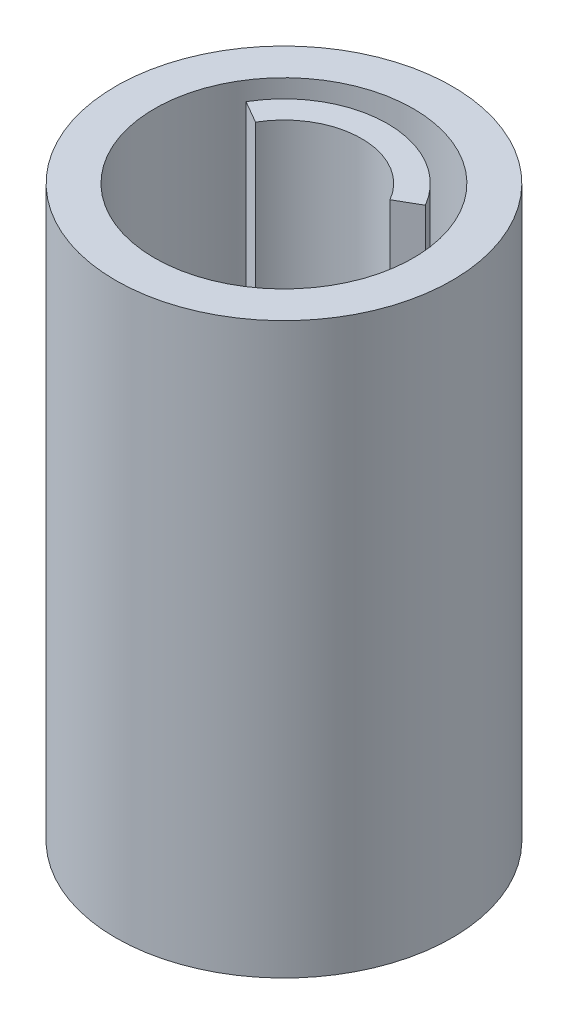
ISO-10303-21;
HEADER;
FILE_DESCRIPTION(('STEP AP214'),'2;1');
FILE_NAME('part.step','',(''),(''),'','','');
FILE_SCHEMA(('AUTOMOTIVE_DESIGN { 1 0 10303 214 1 1 1 1 }'));
ENDSEC;
DATA;
#1=APPLICATION_CONTEXT('core data for automotive mechanical design processes');
#2=APPLICATION_PROTOCOL_DEFINITION('international standard','automotive_design',2000,#1);
#3=PRODUCT_CONTEXT('',#1,'mechanical');
#4=PRODUCT('Part','Part','',(#3));
#5=PRODUCT_RELATED_PRODUCT_CATEGORY('part','',(#4));
#6=PRODUCT_DEFINITION_FORMATION('','',#4);
#7=PRODUCT_DEFINITION_CONTEXT('part definition',#1,'design');
#8=PRODUCT_DEFINITION('design','',#6,#7);
#9=PRODUCT_DEFINITION_SHAPE('','',#8);
#10=(LENGTH_UNIT() NAMED_UNIT(*) SI_UNIT(.MILLI.,.METRE.));
#11=(NAMED_UNIT(*) PLANE_ANGLE_UNIT() SI_UNIT($,.RADIAN.));
#12=(NAMED_UNIT(*) SI_UNIT($,.STERADIAN.) SOLID_ANGLE_UNIT());
#13=UNCERTAINTY_MEASURE_WITH_UNIT(LENGTH_MEASURE(1.E-05),#10,'distance_accuracy_value','');
#14=(GEOMETRIC_REPRESENTATION_CONTEXT(3) GLOBAL_UNCERTAINTY_ASSIGNED_CONTEXT((#13)) GLOBAL_UNIT_ASSIGNED_CONTEXT((#10,
#11,#12)) REPRESENTATION_CONTEXT('',''));
#15=CARTESIAN_POINT('',(0.,0.,0.));
#16=DIRECTION('',(0.,0.,1.));
#17=DIRECTION('',(1.,0.,0.));
#18=AXIS2_PLACEMENT_3D('',#15,#16,#17);
#19=CARTESIAN_POINT('',(0.,22.,0.));
#20=DIRECTION('',(0.,1.,0.));
#21=DIRECTION('',(0.,0.,1.));
#22=AXIS2_PLACEMENT_3D('',#19,#20,#21);
#23=PLANE('',#22);
#24=CARTESIAN_POINT('',(0.,22.,0.));
#25=DIRECTION('',(0.,1.,0.));
#26=DIRECTION('',(0.,0.,1.));
#27=AXIS2_PLACEMENT_3D('',#24,#25,#26);
#28=CIRCLE('',#27,6.5);
#29=CARTESIAN_POINT('',(0.,22.,6.5));
#30=VERTEX_POINT('',#29);
#31=EDGE_CURVE('E11',#30,#30,#28,.T.);
#32=ORIENTED_EDGE('',*,*,#31,.T.);
#33=EDGE_LOOP('',(#32));
#34=FACE_BOUND('',#33,.T.);
#35=CARTESIAN_POINT('',(0.,22.,0.));
#36=DIRECTION('',(0.,1.,0.));
#37=DIRECTION('',(0.,0.,1.));
#38=AXIS2_PLACEMENT_3D('',#35,#36,#37);
#39=CIRCLE('',#38,5.);
#40=CARTESIAN_POINT('',(0.,22.,5.));
#41=VERTEX_POINT('',#40);
#42=EDGE_CURVE('E138',#41,#41,#39,.T.);
#43=ORIENTED_EDGE('',*,*,#42,.F.);
#44=EDGE_LOOP('',(#43));
#45=FACE_BOUND('',#44,.T.);
#46=ADVANCED_FACE('F44',(#34,#45),#23,.T.);
#47=CARTESIAN_POINT('',(0.,22.,0.));
#48=DIRECTION('',(0.,-1.,0.));
#49=DIRECTION('',(0.,0.,-1.));
#50=AXIS2_PLACEMENT_3D('',#47,#48,#49);
#51=CYLINDRICAL_SURFACE('',#50,6.5);
#52=ORIENTED_EDGE('',*,*,#31,.F.);
#53=EDGE_LOOP('',(#52));
#54=FACE_BOUND('',#53,.T.);
#55=CARTESIAN_POINT('',(0.,0.,0.));
#56=DIRECTION('',(0.,1.,0.));
#57=DIRECTION('',(0.,0.,1.));
#58=AXIS2_PLACEMENT_3D('',#55,#56,#57);
#59=CIRCLE('',#58,6.5);
#60=CARTESIAN_POINT('',(0.,0.,6.5));
#61=VERTEX_POINT('',#60);
#62=EDGE_CURVE('E48',#61,#61,#59,.T.);
#63=ORIENTED_EDGE('',*,*,#62,.T.);
#64=EDGE_LOOP('',(#63));
#65=FACE_BOUND('',#64,.T.);
#66=ADVANCED_FACE('F46',(#54,#65),#51,.T.);
#67=CARTESIAN_POINT('',(0.,0.,0.));
#68=DIRECTION('',(0.,1.,0.));
#69=DIRECTION('',(0.,0.,1.));
#70=AXIS2_PLACEMENT_3D('',#67,#68,#69);
#71=PLANE('',#70);
#72=CARTESIAN_POINT('',(0.,0.,-4.5));
#73=DIRECTION('',(0.,1.,0.));
#74=DIRECTION('',(0.,0.,1.));
#75=AXIS2_PLACEMENT_3D('',#72,#73,#74);
#76=CIRCLE('',#75,0.3);
#77=CARTESIAN_POINT('',(0.,0.,-4.2));
#78=VERTEX_POINT('',#77);
#79=EDGE_CURVE('E283',#78,#78,#76,.T.);
#80=ORIENTED_EDGE('',*,*,#79,.T.);
#81=EDGE_LOOP('',(#80));
#82=FACE_BOUND('',#81,.T.);
#83=CARTESIAN_POINT('',(-3.18198051533947,0.,-3.18198051533946));
#84=DIRECTION('',(0.,1.,0.));
#85=DIRECTION('',(0.,0.,-1.));
#86=AXIS2_PLACEMENT_3D('',#83,#84,#85);
#87=CIRCLE('',#86,0.3);
#88=CARTESIAN_POINT('',(-3.18198051533947,0.,-3.48198051533946));
#89=VERTEX_POINT('',#88);
#90=EDGE_CURVE('E295',#89,#89,#87,.T.);
#91=ORIENTED_EDGE('',*,*,#90,.T.);
#92=EDGE_LOOP('',(#91));
#93=FACE_BOUND('',#92,.T.);
#94=CARTESIAN_POINT('',(3.18198051533947,0.,-3.18198051533946));
#95=DIRECTION('',(0.,1.,0.));
#96=DIRECTION('',(0.,0.,1.));
#97=AXIS2_PLACEMENT_3D('',#94,#95,#96);
#98=CIRCLE('',#97,0.3);
#99=CARTESIAN_POINT('',(3.18198051533947,0.,-2.88198051533946));
#100=VERTEX_POINT('',#99);
#101=EDGE_CURVE('E305',#100,#100,#98,.T.);
#102=ORIENTED_EDGE('',*,*,#101,.T.);
#103=EDGE_LOOP('',(#102));
#104=FACE_BOUND('',#103,.T.);
#105=CARTESIAN_POINT('',(0.,0.,3.));
#106=DIRECTION('',(0.,1.,0.));
#107=DIRECTION('',(0.,0.,1.));
#108=AXIS2_PLACEMENT_3D('',#105,#106,#107);
#109=CIRCLE('',#108,0.5);
#110=CARTESIAN_POINT('',(0.,0.,3.5));
#111=VERTEX_POINT('',#110);
#112=EDGE_CURVE('E309',#111,#111,#109,.T.);
#113=ORIENTED_EDGE('',*,*,#112,.T.);
#114=EDGE_LOOP('',(#113));
#115=FACE_BOUND('',#114,.T.);
#116=CARTESIAN_POINT('',(-2.89777747886721,0.,0.776457135307554));
#117=DIRECTION('',(0.,1.,0.));
#118=DIRECTION('',(0.,0.,1.));
#119=AXIS2_PLACEMENT_3D('',#116,#117,#118);
#120=CIRCLE('',#119,0.5);
#121=CARTESIAN_POINT('',(-2.89777747886721,0.,1.27645713530755));
#122=VERTEX_POINT('',#121);
#123=EDGE_CURVE('E321',#122,#122,#120,.T.);
#124=ORIENTED_EDGE('',*,*,#123,.T.);
#125=EDGE_LOOP('',(#124));
#126=FACE_BOUND('',#125,.T.);
#127=CARTESIAN_POINT('',(2.89777747886721,0.,0.776457135307554));
#128=DIRECTION('',(0.,1.,0.));
#129=DIRECTION('',(0.,0.,-1.));
#130=AXIS2_PLACEMENT_3D('',#127,#128,#129);
#131=CIRCLE('',#130,0.5);
#132=CARTESIAN_POINT('',(2.89777747886721,0.,0.276457135307554));
#133=VERTEX_POINT('',#132);
#134=EDGE_CURVE('E292',#133,#133,#131,.T.);
#135=ORIENTED_EDGE('',*,*,#134,.T.);
#136=EDGE_LOOP('',(#135));
#137=FACE_BOUND('',#136,.T.);
#138=ORIENTED_EDGE('',*,*,#62,.F.);
#139=EDGE_LOOP('',(#138));
#140=FACE_BOUND('',#139,.T.);
#141=ADVANCED_FACE('F159',(#82,#93,#104,#115,#126,#137,#140),#71,.F.);
#142=CARTESIAN_POINT('',(0.,2.,0.));
#143=DIRECTION('',(0.,1.,0.));
#144=DIRECTION('',(0.,0.,1.));
#145=AXIS2_PLACEMENT_3D('',#142,#143,#144);
#146=PLANE('',#145);
#147=CARTESIAN_POINT('',(0.,2.,-4.5));
#148=DIRECTION('',(0.,1.,0.));
#149=DIRECTION('',(0.,0.,1.));
#150=AXIS2_PLACEMENT_3D('',#147,#148,#149);
#151=CIRCLE('',#150,0.3);
#152=CARTESIAN_POINT('',(0.,2.,-4.2));
#153=VERTEX_POINT('',#152);
#154=EDGE_CURVE('E286',#153,#153,#151,.T.);
#155=ORIENTED_EDGE('',*,*,#154,.F.);
#156=EDGE_LOOP('',(#155));
#157=FACE_BOUND('',#156,.T.);
#158=CARTESIAN_POINT('',(-3.18198051533947,2.,-3.18198051533946));
#159=DIRECTION('',(0.,1.,0.));
#160=DIRECTION('',(0.,0.,-1.));
#161=AXIS2_PLACEMENT_3D('',#158,#159,#160);
#162=CIRCLE('',#161,0.3);
#163=CARTESIAN_POINT('',(-3.18198051533947,2.,-3.48198051533946));
#164=VERTEX_POINT('',#163);
#165=EDGE_CURVE('E288',#164,#164,#162,.T.);
#166=ORIENTED_EDGE('',*,*,#165,.F.);
#167=EDGE_LOOP('',(#166));
#168=FACE_BOUND('',#167,.T.);
#169=CARTESIAN_POINT('',(3.18198051533947,2.,-3.18198051533946));
#170=DIRECTION('',(0.,1.,0.));
#171=DIRECTION('',(0.,0.,1.));
#172=AXIS2_PLACEMENT_3D('',#169,#170,#171);
#173=CIRCLE('',#172,0.3);
#174=CARTESIAN_POINT('',(3.18198051533947,2.,-2.88198051533946));
#175=VERTEX_POINT('',#174);
#176=EDGE_CURVE('E301',#175,#175,#173,.T.);
#177=ORIENTED_EDGE('',*,*,#176,.F.);
#178=EDGE_LOOP('',(#177));
#179=FACE_BOUND('',#178,.T.);
#180=CARTESIAN_POINT('',(0.,2.,3.));
#181=DIRECTION('',(0.,1.,0.));
#182=DIRECTION('',(0.,0.,1.));
#183=AXIS2_PLACEMENT_3D('',#180,#181,#182);
#184=CIRCLE('',#183,0.5);
#185=CARTESIAN_POINT('',(0.,2.,3.5));
#186=VERTEX_POINT('',#185);
#187=EDGE_CURVE('E313',#186,#186,#184,.T.);
#188=ORIENTED_EDGE('',*,*,#187,.F.);
#189=EDGE_LOOP('',(#188));
#190=FACE_BOUND('',#189,.T.);
#191=CARTESIAN_POINT('',(-2.89777747886721,2.,0.776457135307554));
#192=DIRECTION('',(0.,1.,0.));
#193=DIRECTION('',(0.,0.,1.));
#194=AXIS2_PLACEMENT_3D('',#191,#192,#193);
#195=CIRCLE('',#194,0.5);
#196=CARTESIAN_POINT('',(-2.89777747886721,2.,1.27645713530755));
#197=VERTEX_POINT('',#196);
#198=EDGE_CURVE('E317',#197,#197,#195,.T.);
#199=ORIENTED_EDGE('',*,*,#198,.F.);
#200=EDGE_LOOP('',(#199));
#201=FACE_BOUND('',#200,.T.);
#202=CARTESIAN_POINT('',(2.89777747886721,2.,0.776457135307554));
#203=DIRECTION('',(0.,1.,0.));
#204=DIRECTION('',(0.,0.,-1.));
#205=AXIS2_PLACEMENT_3D('',#202,#203,#204);
#206=CIRCLE('',#205,0.5);
#207=CARTESIAN_POINT('',(2.89777747886721,2.,0.276457135307554));
#208=VERTEX_POINT('',#207);
#209=EDGE_CURVE('E325',#208,#208,#206,.T.);
#210=ORIENTED_EDGE('',*,*,#209,.F.);
#211=EDGE_LOOP('',(#210));
#212=FACE_BOUND('',#211,.T.);
#213=CARTESIAN_POINT('',(0.,2.,0.));
#214=DIRECTION('',(0.,-1.,0.));
#215=DIRECTION('',(0.,0.,-1.));
#216=AXIS2_PLACEMENT_3D('',#213,#214,#215);
#217=CIRCLE('',#216,0.75);
#218=CARTESIAN_POINT('',(0.,2.,-0.75));
#219=VERTEX_POINT('',#218);
#220=EDGE_CURVE('E116',#219,#219,#217,.T.);
#221=ORIENTED_EDGE('',*,*,#220,.T.);
#222=EDGE_LOOP('',(#221));
#223=FACE_BOUND('',#222,.T.);
#224=CARTESIAN_POINT('',(0.,2.,0.));
#225=DIRECTION('',(0.,1.,0.));
#226=DIRECTION('',(0.,0.,1.));
#227=AXIS2_PLACEMENT_3D('',#224,#225,#226);
#228=CIRCLE('',#227,5.);
#229=CARTESIAN_POINT('',(0.,2.,5.));
#230=VERTEX_POINT('',#229);
#231=EDGE_CURVE('E94',#230,#230,#228,.T.);
#232=ORIENTED_EDGE('',*,*,#231,.T.);
#233=EDGE_LOOP('',(#232));
#234=FACE_BOUND('',#233,.T.);
#235=CARTESIAN_POINT('',(0.,2.,0.));
#236=DIRECTION('',(0.,-1.,0.));
#237=DIRECTION('',(0.,0.,-1.));
#238=AXIS2_PLACEMENT_3D('',#235,#236,#237);
#239=CIRCLE('',#238,3.);
#240=CARTESIAN_POINT('',(-2.59807621135332,2.,-1.49999999999999));
#241=VERTEX_POINT('',#240);
#242=CARTESIAN_POINT('',(2.59807621135332,2.,-1.49999999999999));
#243=VERTEX_POINT('',#242);
#244=EDGE_CURVE('E90',#241,#243,#239,.T.);
#245=ORIENTED_EDGE('',*,*,#244,.F.);
#246=DIRECTION('',(0.86602540378444,0.,0.499999999999998));
#247=VECTOR('',#246,1.);
#248=CARTESIAN_POINT('',(-3.46410161513776,2.,-1.99999999999999));
#249=LINE('',#248,#247);
#250=CARTESIAN_POINT('',(-3.46410161513776,2.,-1.99999999999999));
#251=VERTEX_POINT('',#250);
#252=EDGE_CURVE('E109',#251,#241,#249,.T.);
#253=ORIENTED_EDGE('',*,*,#252,.F.);
#254=CARTESIAN_POINT('',(0.,2.,0.));
#255=DIRECTION('',(0.,1.,0.));
#256=DIRECTION('',(0.,0.,-1.));
#257=AXIS2_PLACEMENT_3D('',#254,#255,#256);
#258=CIRCLE('',#257,4.);
#259=CARTESIAN_POINT('',(3.46410161513776,2.,-1.99999999999999));
#260=VERTEX_POINT('',#259);
#261=EDGE_CURVE('E113',#260,#251,#258,.T.);
#262=ORIENTED_EDGE('',*,*,#261,.F.);
#263=DIRECTION('',(0.86602540378444,0.,-0.499999999999998));
#264=VECTOR('',#263,1.);
#265=CARTESIAN_POINT('',(2.59807621135332,2.,-1.49999999999999));
#266=LINE('',#265,#264);
#267=EDGE_CURVE('E126',#243,#260,#266,.T.);
#268=ORIENTED_EDGE('',*,*,#267,.F.);
#269=EDGE_LOOP('',(#245,#253,#262,#268));
#270=FACE_BOUND('',#269,.T.);
#271=ADVANCED_FACE('F146',(#157,#168,#179,#190,#201,#212,#223,#234,#270),#146,.T.);
#272=CARTESIAN_POINT('',(0.,22.,0.));
#273=DIRECTION('',(0.,-1.,0.));
#274=DIRECTION('',(0.,0.,-1.));
#275=AXIS2_PLACEMENT_3D('',#272,#273,#274);
#276=CYLINDRICAL_SURFACE('',#275,5.);
#277=ORIENTED_EDGE('',*,*,#42,.T.);
#278=EDGE_LOOP('',(#277));
#279=FACE_BOUND('',#278,.T.);
#280=ORIENTED_EDGE('',*,*,#231,.F.);
#281=EDGE_LOOP('',(#280));
#282=FACE_BOUND('',#281,.T.);
#283=ADVANCED_FACE('F149',(#279,#282),#276,.F.);
#284=CARTESIAN_POINT('',(0.,22.,0.));
#285=DIRECTION('',(0.,-1.,0.));
#286=DIRECTION('',(0.,0.,-1.));
#287=AXIS2_PLACEMENT_3D('',#284,#285,#286);
#288=CYLINDRICAL_SURFACE('',#287,3.);
#289=ORIENTED_EDGE('',*,*,#244,.T.);
#290=DIRECTION('',(0.,-1.,0.));
#291=VECTOR('',#290,1.);
#292=CARTESIAN_POINT('',(2.59807621135332,22.,-1.49999999999999));
#293=LINE('',#292,#291);
#294=CARTESIAN_POINT('',(2.59807621135332,22.,-1.49999999999999));
#295=VERTEX_POINT('',#294);
#296=EDGE_CURVE('E87',#295,#243,#293,.T.);
#297=ORIENTED_EDGE('',*,*,#296,.F.);
#298=CARTESIAN_POINT('',(0.,22.,0.));
#299=DIRECTION('',(0.,-1.,0.));
#300=DIRECTION('',(0.,0.,-1.));
#301=AXIS2_PLACEMENT_3D('',#298,#299,#300);
#302=CIRCLE('',#301,3.);
#303=CARTESIAN_POINT('',(-2.59807621135332,22.,-1.49999999999999));
#304=VERTEX_POINT('',#303);
#305=EDGE_CURVE('E60',#304,#295,#302,.T.);
#306=ORIENTED_EDGE('',*,*,#305,.F.);
#307=DIRECTION('',(0.,-1.,0.));
#308=VECTOR('',#307,1.);
#309=CARTESIAN_POINT('',(-2.59807621135332,22.,-1.49999999999999));
#310=LINE('',#309,#308);
#311=EDGE_CURVE('E123',#304,#241,#310,.T.);
#312=ORIENTED_EDGE('',*,*,#311,.T.);
#313=EDGE_LOOP('',(#289,#297,#306,#312));
#314=FACE_BOUND('',#313,.T.);
#315=ADVANCED_FACE('F89',(#314),#288,.F.);
#316=CARTESIAN_POINT('',(2.59807621135332,22.,-1.49999999999999));
#317=DIRECTION('',(-0.499999999999998,0.,-0.86602540378444));
#318=DIRECTION('',(-0.86602540378444,0.,0.499999999999998));
#319=AXIS2_PLACEMENT_3D('',#316,#317,#318);
#320=PLANE('',#319);
#321=ORIENTED_EDGE('',*,*,#267,.T.);
#322=DIRECTION('',(0.,-1.,0.));
#323=VECTOR('',#322,1.);
#324=CARTESIAN_POINT('',(3.46410161513776,22.,-1.99999999999999));
#325=LINE('',#324,#323);
#326=CARTESIAN_POINT('',(3.46410161513776,22.,-1.99999999999999));
#327=VERTEX_POINT('',#326);
#328=EDGE_CURVE('E95',#327,#260,#325,.T.);
#329=ORIENTED_EDGE('',*,*,#328,.F.);
#330=DIRECTION('',(0.86602540378444,0.,-0.499999999999998));
#331=VECTOR('',#330,1.);
#332=CARTESIAN_POINT('',(2.59807621135332,22.,-1.49999999999999));
#333=LINE('',#332,#331);
#334=EDGE_CURVE('E98',#295,#327,#333,.T.);
#335=ORIENTED_EDGE('',*,*,#334,.F.);
#336=ORIENTED_EDGE('',*,*,#296,.T.);
#337=EDGE_LOOP('',(#321,#329,#335,#336));
#338=FACE_BOUND('',#337,.T.);
#339=ADVANCED_FACE('F99',(#338),#320,.F.);
#340=CARTESIAN_POINT('',(0.,22.,0.));
#341=DIRECTION('',(0.,-1.,0.));
#342=DIRECTION('',(0.,0.,-1.));
#343=AXIS2_PLACEMENT_3D('',#340,#341,#342);
#344=CYLINDRICAL_SURFACE('',#343,4.);
#345=ORIENTED_EDGE('',*,*,#261,.T.);
#346=DIRECTION('',(0.,-1.,0.));
#347=VECTOR('',#346,1.);
#348=CARTESIAN_POINT('',(-3.46410161513776,22.,-1.99999999999999));
#349=LINE('',#348,#347);
#350=CARTESIAN_POINT('',(-3.46410161513776,22.,-1.99999999999999));
#351=VERTEX_POINT('',#350);
#352=EDGE_CURVE('E68',#351,#251,#349,.T.);
#353=ORIENTED_EDGE('',*,*,#352,.F.);
#354=CARTESIAN_POINT('',(0.,22.,0.));
#355=DIRECTION('',(0.,1.,0.));
#356=DIRECTION('',(0.,0.,-1.));
#357=AXIS2_PLACEMENT_3D('',#354,#355,#356);
#358=CIRCLE('',#357,4.);
#359=EDGE_CURVE('E103',#327,#351,#358,.T.);
#360=ORIENTED_EDGE('',*,*,#359,.F.);
#361=ORIENTED_EDGE('',*,*,#328,.T.);
#362=EDGE_LOOP('',(#345,#353,#360,#361));
#363=FACE_BOUND('',#362,.T.);
#364=ADVANCED_FACE('F193',(#363),#344,.T.);
#365=CARTESIAN_POINT('',(-3.46410161513776,22.,-1.99999999999999));
#366=DIRECTION('',(0.499999999999998,0.,-0.86602540378444));
#367=DIRECTION('',(-0.86602540378444,0.,-0.499999999999998));
#368=AXIS2_PLACEMENT_3D('',#365,#366,#367);
#369=PLANE('',#368);
#370=ORIENTED_EDGE('',*,*,#252,.T.);
#371=ORIENTED_EDGE('',*,*,#311,.F.);
#372=DIRECTION('',(0.86602540378444,0.,0.499999999999998));
#373=VECTOR('',#372,1.);
#374=CARTESIAN_POINT('',(-3.46410161513776,22.,-1.99999999999999));
#375=LINE('',#374,#373);
#376=EDGE_CURVE('E107',#351,#304,#375,.T.);
#377=ORIENTED_EDGE('',*,*,#376,.F.);
#378=ORIENTED_EDGE('',*,*,#352,.T.);
#379=EDGE_LOOP('',(#370,#371,#377,#378));
#380=FACE_BOUND('',#379,.T.);
#381=ADVANCED_FACE('F185',(#380),#369,.F.);
#382=CARTESIAN_POINT('',(0.,17.,0.));
#383=DIRECTION('',(0.,-1.,0.));
#384=DIRECTION('',(0.,0.,-1.));
#385=AXIS2_PLACEMENT_3D('',#382,#383,#384);
#386=CYLINDRICAL_SURFACE('',#385,0.75);
#387=CARTESIAN_POINT('',(0.,17.,0.));
#388=DIRECTION('',(0.,-1.,0.));
#389=DIRECTION('',(0.,0.,-1.));
#390=AXIS2_PLACEMENT_3D('',#387,#388,#389);
#391=CIRCLE('',#390,0.75);
#392=CARTESIAN_POINT('',(0.,17.,-0.75));
#393=VERTEX_POINT('',#392);
#394=EDGE_CURVE('E127',#393,#393,#391,.T.);
#395=ORIENTED_EDGE('',*,*,#394,.T.);
#396=EDGE_LOOP('',(#395));
#397=FACE_BOUND('',#396,.T.);
#398=ORIENTED_EDGE('',*,*,#220,.F.);
#399=EDGE_LOOP('',(#398));
#400=FACE_BOUND('',#399,.T.);
#401=ADVANCED_FACE('F179',(#397,#400),#386,.T.);
#402=CARTESIAN_POINT('',(0.,17.,0.));
#403=DIRECTION('',(0.,-1.,0.));
#404=DIRECTION('',(0.,0.,-1.));
#405=AXIS2_PLACEMENT_3D('',#402,#403,#404);
#406=PLANE('',#405);
#407=ORIENTED_EDGE('',*,*,#394,.F.);
#408=EDGE_LOOP('',(#407));
#409=FACE_BOUND('',#408,.T.);
#410=ADVANCED_FACE('F171',(#409),#406,.F.);
#411=ORIENTED_EDGE('',*,*,#305,.T.);
#412=ORIENTED_EDGE('',*,*,#334,.T.);
#413=ORIENTED_EDGE('',*,*,#359,.T.);
#414=ORIENTED_EDGE('',*,*,#376,.T.);
#415=EDGE_LOOP('',(#411,#412,#413,#414));
#416=FACE_BOUND('',#415,.T.);
#417=ADVANCED_FACE('F106',(#416),#23,.T.);
#418=CARTESIAN_POINT('',(2.89777747886721,0.,0.776457135307554));
#419=DIRECTION('',(0.,1.,0.));
#420=DIRECTION('',(0.,0.,1.));
#421=AXIS2_PLACEMENT_3D('',#418,#419,#420);
#422=CYLINDRICAL_SURFACE('',#421,0.5);
#423=ORIENTED_EDGE('',*,*,#134,.F.);
#424=EDGE_LOOP('',(#423));
#425=FACE_BOUND('',#424,.T.);
#426=ORIENTED_EDGE('',*,*,#209,.T.);
#427=EDGE_LOOP('',(#426));
#428=FACE_BOUND('',#427,.T.);
#429=ADVANCED_FACE('F170',(#425,#428),#422,.F.);
#430=CARTESIAN_POINT('',(-2.89777747886721,0.,0.776457135307554));
#431=DIRECTION('',(0.,1.,0.));
#432=DIRECTION('',(0.,0.,1.));
#433=AXIS2_PLACEMENT_3D('',#430,#431,#432);
#434=CYLINDRICAL_SURFACE('',#433,0.5);
#435=ORIENTED_EDGE('',*,*,#123,.F.);
#436=EDGE_LOOP('',(#435));
#437=FACE_BOUND('',#436,.T.);
#438=ORIENTED_EDGE('',*,*,#198,.T.);
#439=EDGE_LOOP('',(#438));
#440=FACE_BOUND('',#439,.T.);
#441=ADVANCED_FACE('F176',(#437,#440),#434,.F.);
#442=CARTESIAN_POINT('',(0.,0.,3.));
#443=DIRECTION('',(0.,1.,0.));
#444=DIRECTION('',(0.,0.,1.));
#445=AXIS2_PLACEMENT_3D('',#442,#443,#444);
#446=CYLINDRICAL_SURFACE('',#445,0.5);
#447=ORIENTED_EDGE('',*,*,#112,.F.);
#448=EDGE_LOOP('',(#447));
#449=FACE_BOUND('',#448,.T.);
#450=ORIENTED_EDGE('',*,*,#187,.T.);
#451=EDGE_LOOP('',(#450));
#452=FACE_BOUND('',#451,.T.);
#453=ADVANCED_FACE('F237',(#449,#452),#446,.F.);
#454=CARTESIAN_POINT('',(3.18198051533947,0.,-3.18198051533946));
#455=DIRECTION('',(0.,1.,0.));
#456=DIRECTION('',(0.,0.,1.));
#457=AXIS2_PLACEMENT_3D('',#454,#455,#456);
#458=CYLINDRICAL_SURFACE('',#457,0.3);
#459=ORIENTED_EDGE('',*,*,#101,.F.);
#460=EDGE_LOOP('',(#459));
#461=FACE_BOUND('',#460,.T.);
#462=ORIENTED_EDGE('',*,*,#176,.T.);
#463=EDGE_LOOP('',(#462));
#464=FACE_BOUND('',#463,.T.);
#465=ADVANCED_FACE('F246',(#461,#464),#458,.F.);
#466=CARTESIAN_POINT('',(-3.18198051533947,0.,-3.18198051533946));
#467=DIRECTION('',(0.,1.,0.));
#468=DIRECTION('',(0.,0.,1.));
#469=AXIS2_PLACEMENT_3D('',#466,#467,#468);
#470=CYLINDRICAL_SURFACE('',#469,0.3);
#471=ORIENTED_EDGE('',*,*,#90,.F.);
#472=EDGE_LOOP('',(#471));
#473=FACE_BOUND('',#472,.T.);
#474=ORIENTED_EDGE('',*,*,#165,.T.);
#475=EDGE_LOOP('',(#474));
#476=FACE_BOUND('',#475,.T.);
#477=ADVANCED_FACE('F257',(#473,#476),#470,.F.);
#478=CARTESIAN_POINT('',(0.,0.,-4.5));
#479=DIRECTION('',(0.,1.,0.));
#480=DIRECTION('',(0.,0.,1.));
#481=AXIS2_PLACEMENT_3D('',#478,#479,#480);
#482=CYLINDRICAL_SURFACE('',#481,0.3);
#483=ORIENTED_EDGE('',*,*,#79,.F.);
#484=EDGE_LOOP('',(#483));
#485=FACE_BOUND('',#484,.T.);
#486=ORIENTED_EDGE('',*,*,#154,.T.);
#487=EDGE_LOOP('',(#486));
#488=FACE_BOUND('',#487,.T.);
#489=ADVANCED_FACE('F267',(#485,#488),#482,.F.);
#490=CLOSED_SHELL('',(#46,#66,#141,#271,#283,#315,#339,#364,#381,#401,#410,#417,#429,#441,#453,
#465,#477,#489));
#491=MANIFOLD_SOLID_BREP('B2',#490);
#492=ADVANCED_BREP_SHAPE_REPRESENTATION('',(#18,#491),#14);
#493=SHAPE_DEFINITION_REPRESENTATION(#9,#492);
ENDSEC;
END-ISO-10303-21;
